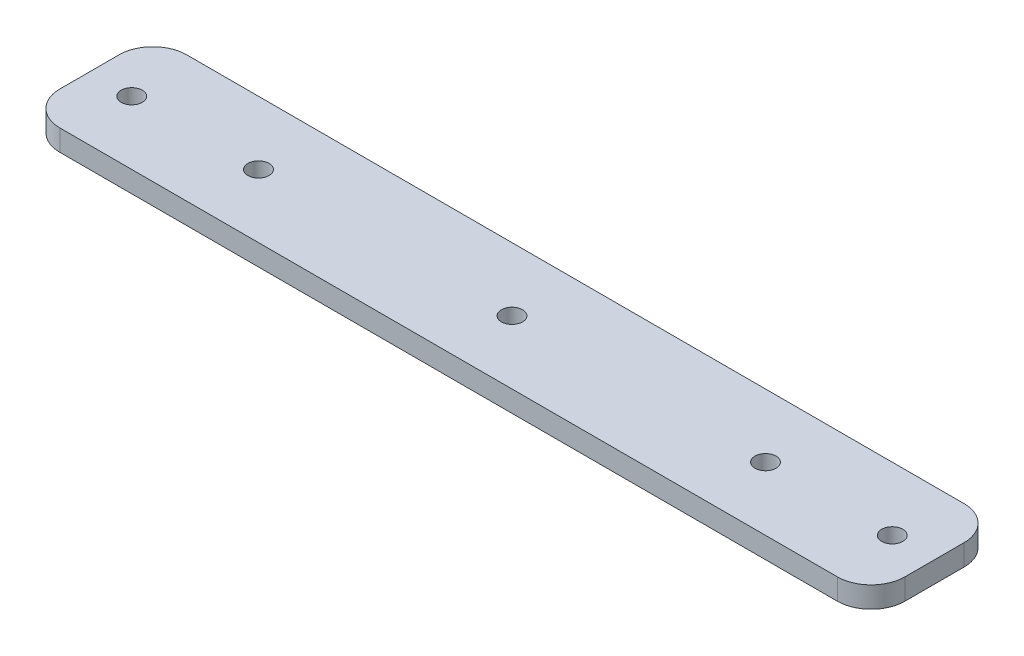
ISO-10303-21;
HEADER;
FILE_DESCRIPTION(('STEP AP214'),'2;1');
FILE_NAME('part.step','',(''),(''),'','','');
FILE_SCHEMA(('AUTOMOTIVE_DESIGN { 1 0 10303 214 1 1 1 1 }'));
ENDSEC;
DATA;
#1=APPLICATION_CONTEXT('core data for automotive mechanical design processes');
#2=APPLICATION_PROTOCOL_DEFINITION('international standard','automotive_design',2000,#1);
#3=PRODUCT_CONTEXT('',#1,'mechanical');
#4=PRODUCT('Part','Part','',(#3));
#5=PRODUCT_RELATED_PRODUCT_CATEGORY('part','',(#4));
#6=PRODUCT_DEFINITION_FORMATION('','',#4);
#7=PRODUCT_DEFINITION_CONTEXT('part definition',#1,'design');
#8=PRODUCT_DEFINITION('design','',#6,#7);
#9=PRODUCT_DEFINITION_SHAPE('','',#8);
#10=(LENGTH_UNIT() NAMED_UNIT(*) SI_UNIT(.MILLI.,.METRE.));
#11=(NAMED_UNIT(*) PLANE_ANGLE_UNIT() SI_UNIT($,.RADIAN.));
#12=(NAMED_UNIT(*) SI_UNIT($,.STERADIAN.) SOLID_ANGLE_UNIT());
#13=UNCERTAINTY_MEASURE_WITH_UNIT(LENGTH_MEASURE(1.E-05),#10,'distance_accuracy_value','');
#14=(GEOMETRIC_REPRESENTATION_CONTEXT(3) GLOBAL_UNCERTAINTY_ASSIGNED_CONTEXT((#13)) GLOBAL_UNIT_ASSIGNED_CONTEXT((#10,
#11,#12)) REPRESENTATION_CONTEXT('',''));
#15=CARTESIAN_POINT('',(0.,0.,0.));
#16=DIRECTION('',(0.,0.,1.));
#17=DIRECTION('',(1.,0.,0.));
#18=AXIS2_PLACEMENT_3D('',#15,#16,#17);
#19=CARTESIAN_POINT('',(243.84,6.35,27.94));
#20=DIRECTION('',(0.,1.,0.));
#21=DIRECTION('',(0.,0.,1.));
#22=AXIS2_PLACEMENT_3D('',#19,#20,#21);
#23=PLANE('',#22);
#24=CARTESIAN_POINT('',(127.,6.35,19.05));
#25=DIRECTION('',(0.,1.,0.));
#26=DIRECTION('',(0.,0.,1.));
#27=AXIS2_PLACEMENT_3D('',#24,#25,#26);
#28=CIRCLE('',#27,3.175);
#29=CARTESIAN_POINT('',(127.,6.35,22.225));
#30=VERTEX_POINT('',#29);
#31=EDGE_CURVE('E198',#30,#30,#28,.T.);
#32=ORIENTED_EDGE('',*,*,#31,.F.);
#33=EDGE_LOOP('',(#32));
#34=FACE_BOUND('',#33,.T.);
#35=CARTESIAN_POINT('',(50.8,6.35,19.05));
#36=DIRECTION('',(0.,1.,0.));
#37=DIRECTION('',(0.,0.,1.));
#38=AXIS2_PLACEMENT_3D('',#35,#36,#37);
#39=CIRCLE('',#38,3.175);
#40=CARTESIAN_POINT('',(50.8,6.35,22.225));
#41=VERTEX_POINT('',#40);
#42=EDGE_CURVE('E186',#41,#41,#39,.T.);
#43=ORIENTED_EDGE('',*,*,#42,.F.);
#44=EDGE_LOOP('',(#43));
#45=FACE_BOUND('',#44,.T.);
#46=CARTESIAN_POINT('',(243.84,6.35,27.94));
#47=DIRECTION('',(0.,1.,0.));
#48=DIRECTION('',(0.,0.,1.));
#49=AXIS2_PLACEMENT_3D('',#46,#47,#48);
#50=CIRCLE('',#49,10.16);
#51=CARTESIAN_POINT('',(243.84,6.35,38.1));
#52=VERTEX_POINT('',#51);
#53=CARTESIAN_POINT('',(254.,6.35,27.9399999999999));
#54=VERTEX_POINT('',#53);
#55=EDGE_CURVE('E149',#52,#54,#50,.T.);
#56=ORIENTED_EDGE('',*,*,#55,.T.);
#57=DIRECTION('',(0.,0.,-1.));
#58=VECTOR('',#57,1.);
#59=CARTESIAN_POINT('',(254.,6.35,10.1600000000001));
#60=LINE('',#59,#58);
#61=CARTESIAN_POINT('',(254.,6.35,10.1600000000001));
#62=VERTEX_POINT('',#61);
#63=EDGE_CURVE('E97',#54,#62,#60,.T.);
#64=ORIENTED_EDGE('',*,*,#63,.T.);
#65=CARTESIAN_POINT('',(243.84,6.35,10.16));
#66=DIRECTION('',(0.,1.,0.));
#67=DIRECTION('',(0.,0.,1.));
#68=AXIS2_PLACEMENT_3D('',#65,#66,#67);
#69=CIRCLE('',#68,10.16);
#70=CARTESIAN_POINT('',(243.84,6.35,0.));
#71=VERTEX_POINT('',#70);
#72=EDGE_CURVE('E164',#62,#71,#69,.T.);
#73=ORIENTED_EDGE('',*,*,#72,.T.);
#74=DIRECTION('',(-1.,0.,0.));
#75=VECTOR('',#74,1.);
#76=CARTESIAN_POINT('',(10.1600000000001,6.35,0.));
#77=LINE('',#76,#75);
#78=CARTESIAN_POINT('',(10.16,6.35,0.));
#79=VERTEX_POINT('',#78);
#80=EDGE_CURVE('E177',#71,#79,#77,.T.);
#81=ORIENTED_EDGE('',*,*,#80,.T.);
#82=CARTESIAN_POINT('',(10.16,6.35,10.16));
#83=DIRECTION('',(0.,1.,0.));
#84=DIRECTION('',(0.,0.,-1.));
#85=AXIS2_PLACEMENT_3D('',#82,#83,#84);
#86=CIRCLE('',#85,10.16);
#87=CARTESIAN_POINT('',(0.,6.35,10.1600000000001));
#88=VERTEX_POINT('',#87);
#89=EDGE_CURVE('E116',#79,#88,#86,.T.);
#90=ORIENTED_EDGE('',*,*,#89,.T.);
#91=DIRECTION('',(0.,0.,1.));
#92=VECTOR('',#91,1.);
#93=CARTESIAN_POINT('',(0.,6.35,10.1600000000001));
#94=LINE('',#93,#92);
#95=CARTESIAN_POINT('',(0.,6.35,27.9399999999999));
#96=VERTEX_POINT('',#95);
#97=EDGE_CURVE('E110',#88,#96,#94,.T.);
#98=ORIENTED_EDGE('',*,*,#97,.T.);
#99=CARTESIAN_POINT('',(10.16,6.35,27.94));
#100=DIRECTION('',(0.,1.,0.));
#101=DIRECTION('',(0.,0.,1.));
#102=AXIS2_PLACEMENT_3D('',#99,#100,#101);
#103=CIRCLE('',#102,10.16);
#104=CARTESIAN_POINT('',(10.1600000000001,6.35,38.1));
#105=VERTEX_POINT('',#104);
#106=EDGE_CURVE('E114',#96,#105,#103,.T.);
#107=ORIENTED_EDGE('',*,*,#106,.T.);
#108=DIRECTION('',(1.,0.,0.));
#109=VECTOR('',#108,1.);
#110=CARTESIAN_POINT('',(10.1600000000001,6.35,38.1));
#111=LINE('',#110,#109);
#112=EDGE_CURVE('E54',#105,#52,#111,.T.);
#113=ORIENTED_EDGE('',*,*,#112,.T.);
#114=EDGE_LOOP('',(#56,#64,#73,#81,#90,#98,#107,#113));
#115=FACE_BOUND('',#114,.T.);
#116=CARTESIAN_POINT('',(12.7,6.35,19.05));
#117=DIRECTION('',(0.,1.,0.));
#118=DIRECTION('',(0.,0.,1.));
#119=AXIS2_PLACEMENT_3D('',#116,#117,#118);
#120=CIRCLE('',#119,3.175);
#121=CARTESIAN_POINT('',(12.7,6.35,22.225));
#122=VERTEX_POINT('',#121);
#123=EDGE_CURVE('E138',#122,#122,#120,.T.);
#124=ORIENTED_EDGE('',*,*,#123,.F.);
#125=EDGE_LOOP('',(#124));
#126=FACE_BOUND('',#125,.T.);
#127=CARTESIAN_POINT('',(241.3,6.35,19.05));
#128=DIRECTION('',(0.,1.,0.));
#129=DIRECTION('',(0.,0.,-1.));
#130=AXIS2_PLACEMENT_3D('',#127,#128,#129);
#131=CIRCLE('',#130,3.175);
#132=CARTESIAN_POINT('',(241.3,6.35,15.875));
#133=VERTEX_POINT('',#132);
#134=EDGE_CURVE('E192',#133,#133,#131,.T.);
#135=ORIENTED_EDGE('',*,*,#134,.F.);
#136=EDGE_LOOP('',(#135));
#137=FACE_BOUND('',#136,.T.);
#138=CARTESIAN_POINT('',(203.2,6.35,19.05));
#139=DIRECTION('',(0.,1.,0.));
#140=DIRECTION('',(0.,0.,1.));
#141=AXIS2_PLACEMENT_3D('',#138,#139,#140);
#142=CIRCLE('',#141,3.175);
#143=CARTESIAN_POINT('',(203.2,6.35,22.225));
#144=VERTEX_POINT('',#143);
#145=EDGE_CURVE('E204',#144,#144,#142,.T.);
#146=ORIENTED_EDGE('',*,*,#145,.F.);
#147=EDGE_LOOP('',(#146));
#148=FACE_BOUND('',#147,.T.);
#149=ADVANCED_FACE('F37',(#34,#45,#115,#126,#137,#148),#23,.T.);
#150=CARTESIAN_POINT('',(243.84,0.,27.94));
#151=DIRECTION('',(0.,1.,0.));
#152=DIRECTION('',(0.,0.,1.));
#153=AXIS2_PLACEMENT_3D('',#150,#151,#152);
#154=PLANE('',#153);
#155=CARTESIAN_POINT('',(243.84,0.,27.94));
#156=DIRECTION('',(0.,1.,0.));
#157=DIRECTION('',(0.,0.,1.));
#158=AXIS2_PLACEMENT_3D('',#155,#156,#157);
#159=CIRCLE('',#158,10.16);
#160=CARTESIAN_POINT('',(243.84,0.,38.1));
#161=VERTEX_POINT('',#160);
#162=CARTESIAN_POINT('',(254.,0.,27.9399999999999));
#163=VERTEX_POINT('',#162);
#164=EDGE_CURVE('E134',#161,#163,#159,.T.);
#165=ORIENTED_EDGE('',*,*,#164,.F.);
#166=DIRECTION('',(1.,0.,0.));
#167=VECTOR('',#166,1.);
#168=CARTESIAN_POINT('',(10.1600000000001,0.,38.1));
#169=LINE('',#168,#167);
#170=CARTESIAN_POINT('',(10.1600000000001,0.,38.1));
#171=VERTEX_POINT('',#170);
#172=EDGE_CURVE('E89',#171,#161,#169,.T.);
#173=ORIENTED_EDGE('',*,*,#172,.F.);
#174=CARTESIAN_POINT('',(10.16,0.,27.94));
#175=DIRECTION('',(0.,1.,0.));
#176=DIRECTION('',(0.,0.,1.));
#177=AXIS2_PLACEMENT_3D('',#174,#175,#176);
#178=CIRCLE('',#177,10.16);
#179=CARTESIAN_POINT('',(0.,0.,27.9399999999999));
#180=VERTEX_POINT('',#179);
#181=EDGE_CURVE('E83',#180,#171,#178,.T.);
#182=ORIENTED_EDGE('',*,*,#181,.F.);
#183=DIRECTION('',(0.,0.,1.));
#184=VECTOR('',#183,1.);
#185=CARTESIAN_POINT('',(0.,0.,10.1600000000001));
#186=LINE('',#185,#184);
#187=CARTESIAN_POINT('',(0.,0.,10.1600000000001));
#188=VERTEX_POINT('',#187);
#189=EDGE_CURVE('E124',#188,#180,#186,.T.);
#190=ORIENTED_EDGE('',*,*,#189,.F.);
#191=CARTESIAN_POINT('',(10.16,0.,10.16));
#192=DIRECTION('',(0.,1.,0.));
#193=DIRECTION('',(0.,0.,-1.));
#194=AXIS2_PLACEMENT_3D('',#191,#192,#193);
#195=CIRCLE('',#194,10.16);
#196=CARTESIAN_POINT('',(10.16,0.,0.));
#197=VERTEX_POINT('',#196);
#198=EDGE_CURVE('E144',#197,#188,#195,.T.);
#199=ORIENTED_EDGE('',*,*,#198,.F.);
#200=DIRECTION('',(-1.,0.,0.));
#201=VECTOR('',#200,1.);
#202=CARTESIAN_POINT('',(10.1600000000001,0.,0.));
#203=LINE('',#202,#201);
#204=CARTESIAN_POINT('',(243.84,0.,0.));
#205=VERTEX_POINT('',#204);
#206=EDGE_CURVE('E142',#205,#197,#203,.T.);
#207=ORIENTED_EDGE('',*,*,#206,.F.);
#208=CARTESIAN_POINT('',(243.84,0.,10.16));
#209=DIRECTION('',(0.,1.,0.));
#210=DIRECTION('',(0.,0.,1.));
#211=AXIS2_PLACEMENT_3D('',#208,#209,#210);
#212=CIRCLE('',#211,10.16);
#213=CARTESIAN_POINT('',(254.,0.,10.1600000000001));
#214=VERTEX_POINT('',#213);
#215=EDGE_CURVE('E140',#214,#205,#212,.T.);
#216=ORIENTED_EDGE('',*,*,#215,.F.);
#217=DIRECTION('',(0.,0.,-1.));
#218=VECTOR('',#217,1.);
#219=CARTESIAN_POINT('',(254.,0.,10.1600000000001));
#220=LINE('',#219,#218);
#221=EDGE_CURVE('E137',#163,#214,#220,.T.);
#222=ORIENTED_EDGE('',*,*,#221,.F.);
#223=EDGE_LOOP('',(#165,#173,#182,#190,#199,#207,#216,#222));
#224=FACE_BOUND('',#223,.T.);
#225=CARTESIAN_POINT('',(12.7,0.,19.05));
#226=DIRECTION('',(0.,1.,0.));
#227=DIRECTION('',(0.,0.,1.));
#228=AXIS2_PLACEMENT_3D('',#225,#226,#227);
#229=CIRCLE('',#228,3.175);
#230=CARTESIAN_POINT('',(12.7,0.,22.225));
#231=VERTEX_POINT('',#230);
#232=EDGE_CURVE('E183',#231,#231,#229,.T.);
#233=ORIENTED_EDGE('',*,*,#232,.T.);
#234=EDGE_LOOP('',(#233));
#235=FACE_BOUND('',#234,.T.);
#236=CARTESIAN_POINT('',(50.8,0.,19.05));
#237=DIRECTION('',(0.,1.,0.));
#238=DIRECTION('',(0.,0.,1.));
#239=AXIS2_PLACEMENT_3D('',#236,#237,#238);
#240=CIRCLE('',#239,3.175);
#241=CARTESIAN_POINT('',(50.8,0.,22.225));
#242=VERTEX_POINT('',#241);
#243=EDGE_CURVE('E189',#242,#242,#240,.T.);
#244=ORIENTED_EDGE('',*,*,#243,.T.);
#245=EDGE_LOOP('',(#244));
#246=FACE_BOUND('',#245,.T.);
#247=CARTESIAN_POINT('',(241.3,0.,19.05));
#248=DIRECTION('',(0.,1.,0.));
#249=DIRECTION('',(0.,0.,-1.));
#250=AXIS2_PLACEMENT_3D('',#247,#248,#249);
#251=CIRCLE('',#250,3.175);
#252=CARTESIAN_POINT('',(241.3,0.,15.875));
#253=VERTEX_POINT('',#252);
#254=EDGE_CURVE('E195',#253,#253,#251,.T.);
#255=ORIENTED_EDGE('',*,*,#254,.T.);
#256=EDGE_LOOP('',(#255));
#257=FACE_BOUND('',#256,.T.);
#258=CARTESIAN_POINT('',(127.,0.,19.05));
#259=DIRECTION('',(0.,1.,0.));
#260=DIRECTION('',(0.,0.,1.));
#261=AXIS2_PLACEMENT_3D('',#258,#259,#260);
#262=CIRCLE('',#261,3.175);
#263=CARTESIAN_POINT('',(127.,0.,22.225));
#264=VERTEX_POINT('',#263);
#265=EDGE_CURVE('E201',#264,#264,#262,.T.);
#266=ORIENTED_EDGE('',*,*,#265,.T.);
#267=EDGE_LOOP('',(#266));
#268=FACE_BOUND('',#267,.T.);
#269=CARTESIAN_POINT('',(203.2,0.,19.05));
#270=DIRECTION('',(0.,1.,0.));
#271=DIRECTION('',(0.,0.,1.));
#272=AXIS2_PLACEMENT_3D('',#269,#270,#271);
#273=CIRCLE('',#272,3.175);
#274=CARTESIAN_POINT('',(203.2,0.,22.225));
#275=VERTEX_POINT('',#274);
#276=EDGE_CURVE('E207',#275,#275,#273,.T.);
#277=ORIENTED_EDGE('',*,*,#276,.T.);
#278=EDGE_LOOP('',(#277));
#279=FACE_BOUND('',#278,.T.);
#280=ADVANCED_FACE('F168',(#224,#235,#246,#257,#268,#279),#154,.F.);
#281=CARTESIAN_POINT('',(243.84,6.35,27.94));
#282=DIRECTION('',(0.,-1.,0.));
#283=DIRECTION('',(0.,0.,-1.));
#284=AXIS2_PLACEMENT_3D('',#281,#282,#283);
#285=CYLINDRICAL_SURFACE('',#284,10.16);
#286=ORIENTED_EDGE('',*,*,#164,.T.);
#287=DIRECTION('',(0.,-1.,0.));
#288=VECTOR('',#287,1.);
#289=CARTESIAN_POINT('',(254.,6.35,27.9399999999999));
#290=LINE('',#289,#288);
#291=EDGE_CURVE('E11',#54,#163,#290,.T.);
#292=ORIENTED_EDGE('',*,*,#291,.F.);
#293=ORIENTED_EDGE('',*,*,#55,.F.);
#294=DIRECTION('',(0.,-1.,0.));
#295=VECTOR('',#294,1.);
#296=CARTESIAN_POINT('',(243.84,6.35,38.1));
#297=LINE('',#296,#295);
#298=EDGE_CURVE('E130',#52,#161,#297,.T.);
#299=ORIENTED_EDGE('',*,*,#298,.T.);
#300=EDGE_LOOP('',(#286,#292,#293,#299));
#301=FACE_BOUND('',#300,.T.);
#302=ADVANCED_FACE('F39',(#301),#285,.T.);
#303=CARTESIAN_POINT('',(254.,6.35,10.1600000000001));
#304=DIRECTION('',(-1.,0.,0.));
#305=DIRECTION('',(0.,0.,1.));
#306=AXIS2_PLACEMENT_3D('',#303,#304,#305);
#307=PLANE('',#306);
#308=ORIENTED_EDGE('',*,*,#221,.T.);
#309=DIRECTION('',(0.,-1.,0.));
#310=VECTOR('',#309,1.);
#311=CARTESIAN_POINT('',(254.,6.35,10.1600000000001));
#312=LINE('',#311,#310);
#313=EDGE_CURVE('E46',#62,#214,#312,.T.);
#314=ORIENTED_EDGE('',*,*,#313,.F.);
#315=ORIENTED_EDGE('',*,*,#63,.F.);
#316=ORIENTED_EDGE('',*,*,#291,.T.);
#317=EDGE_LOOP('',(#308,#314,#315,#316));
#318=FACE_BOUND('',#317,.T.);
#319=ADVANCED_FACE('F241',(#318),#307,.F.);
#320=CARTESIAN_POINT('',(243.84,6.35,10.16));
#321=DIRECTION('',(0.,-1.,0.));
#322=DIRECTION('',(0.,0.,-1.));
#323=AXIS2_PLACEMENT_3D('',#320,#321,#322);
#324=CYLINDRICAL_SURFACE('',#323,10.16);
#325=ORIENTED_EDGE('',*,*,#215,.T.);
#326=DIRECTION('',(0.,-1.,0.));
#327=VECTOR('',#326,1.);
#328=CARTESIAN_POINT('',(243.84,6.35,0.));
#329=LINE('',#328,#327);
#330=EDGE_CURVE('E156',#71,#205,#329,.T.);
#331=ORIENTED_EDGE('',*,*,#330,.F.);
#332=ORIENTED_EDGE('',*,*,#72,.F.);
#333=ORIENTED_EDGE('',*,*,#313,.T.);
#334=EDGE_LOOP('',(#325,#331,#332,#333));
#335=FACE_BOUND('',#334,.T.);
#336=ADVANCED_FACE('F162',(#335),#324,.T.);
#337=CARTESIAN_POINT('',(10.1600000000001,6.35,0.));
#338=DIRECTION('',(0.,0.,1.));
#339=DIRECTION('',(1.,0.,0.));
#340=AXIS2_PLACEMENT_3D('',#337,#338,#339);
#341=PLANE('',#340);
#342=ORIENTED_EDGE('',*,*,#206,.T.);
#343=DIRECTION('',(0.,-1.,0.));
#344=VECTOR('',#343,1.);
#345=CARTESIAN_POINT('',(10.16,6.35,0.));
#346=LINE('',#345,#344);
#347=EDGE_CURVE('E153',#79,#197,#346,.T.);
#348=ORIENTED_EDGE('',*,*,#347,.F.);
#349=ORIENTED_EDGE('',*,*,#80,.F.);
#350=ORIENTED_EDGE('',*,*,#330,.T.);
#351=EDGE_LOOP('',(#342,#348,#349,#350));
#352=FACE_BOUND('',#351,.T.);
#353=ADVANCED_FACE('F173',(#352),#341,.F.);
#354=CARTESIAN_POINT('',(10.16,6.35,10.16));
#355=DIRECTION('',(0.,-1.,0.));
#356=DIRECTION('',(0.,0.,-1.));
#357=AXIS2_PLACEMENT_3D('',#354,#355,#356);
#358=CYLINDRICAL_SURFACE('',#357,10.16);
#359=ORIENTED_EDGE('',*,*,#198,.T.);
#360=DIRECTION('',(0.,-1.,0.));
#361=VECTOR('',#360,1.);
#362=CARTESIAN_POINT('',(0.,6.35,10.1600000000001));
#363=LINE('',#362,#361);
#364=EDGE_CURVE('E125',#88,#188,#363,.T.);
#365=ORIENTED_EDGE('',*,*,#364,.F.);
#366=ORIENTED_EDGE('',*,*,#89,.F.);
#367=ORIENTED_EDGE('',*,*,#347,.T.);
#368=EDGE_LOOP('',(#359,#365,#366,#367));
#369=FACE_BOUND('',#368,.T.);
#370=ADVANCED_FACE('F176',(#369),#358,.T.);
#371=CARTESIAN_POINT('',(0.,6.35,10.1600000000001));
#372=DIRECTION('',(1.,0.,0.));
#373=DIRECTION('',(0.,0.,-1.));
#374=AXIS2_PLACEMENT_3D('',#371,#372,#373);
#375=PLANE('',#374);
#376=ORIENTED_EDGE('',*,*,#189,.T.);
#377=DIRECTION('',(0.,-1.,0.));
#378=VECTOR('',#377,1.);
#379=CARTESIAN_POINT('',(0.,6.35,27.9399999999999));
#380=LINE('',#379,#378);
#381=EDGE_CURVE('E121',#96,#180,#380,.T.);
#382=ORIENTED_EDGE('',*,*,#381,.F.);
#383=ORIENTED_EDGE('',*,*,#97,.F.);
#384=ORIENTED_EDGE('',*,*,#364,.T.);
#385=EDGE_LOOP('',(#376,#382,#383,#384));
#386=FACE_BOUND('',#385,.T.);
#387=ADVANCED_FACE('F122',(#386),#375,.F.);
#388=CARTESIAN_POINT('',(10.16,6.35,27.94));
#389=DIRECTION('',(0.,-1.,0.));
#390=DIRECTION('',(0.,0.,-1.));
#391=AXIS2_PLACEMENT_3D('',#388,#389,#390);
#392=CYLINDRICAL_SURFACE('',#391,10.16);
#393=ORIENTED_EDGE('',*,*,#181,.T.);
#394=DIRECTION('',(0.,-1.,0.));
#395=VECTOR('',#394,1.);
#396=CARTESIAN_POINT('',(10.1600000000001,6.35,38.1));
#397=LINE('',#396,#395);
#398=EDGE_CURVE('E126',#105,#171,#397,.T.);
#399=ORIENTED_EDGE('',*,*,#398,.F.);
#400=ORIENTED_EDGE('',*,*,#106,.F.);
#401=ORIENTED_EDGE('',*,*,#381,.T.);
#402=EDGE_LOOP('',(#393,#399,#400,#401));
#403=FACE_BOUND('',#402,.T.);
#404=ADVANCED_FACE('F128',(#403),#392,.T.);
#405=CARTESIAN_POINT('',(10.1600000000001,6.35,38.1));
#406=DIRECTION('',(0.,0.,-1.));
#407=DIRECTION('',(-1.,0.,0.));
#408=AXIS2_PLACEMENT_3D('',#405,#406,#407);
#409=PLANE('',#408);
#410=ORIENTED_EDGE('',*,*,#172,.T.);
#411=ORIENTED_EDGE('',*,*,#298,.F.);
#412=ORIENTED_EDGE('',*,*,#112,.F.);
#413=ORIENTED_EDGE('',*,*,#398,.T.);
#414=EDGE_LOOP('',(#410,#411,#412,#413));
#415=FACE_BOUND('',#414,.T.);
#416=ADVANCED_FACE('F229',(#415),#409,.F.);
#417=CARTESIAN_POINT('',(12.7,6.35,19.05));
#418=DIRECTION('',(0.,-1.,0.));
#419=DIRECTION('',(0.,0.,-1.));
#420=AXIS2_PLACEMENT_3D('',#417,#418,#419);
#421=CYLINDRICAL_SURFACE('',#420,3.175);
#422=ORIENTED_EDGE('',*,*,#123,.T.);
#423=EDGE_LOOP('',(#422));
#424=FACE_BOUND('',#423,.T.);
#425=ORIENTED_EDGE('',*,*,#232,.F.);
#426=EDGE_LOOP('',(#425));
#427=FACE_BOUND('',#426,.T.);
#428=ADVANCED_FACE('F226',(#424,#427),#421,.F.);
#429=CARTESIAN_POINT('',(50.8,6.35,19.05));
#430=DIRECTION('',(0.,-1.,0.));
#431=DIRECTION('',(0.,0.,-1.));
#432=AXIS2_PLACEMENT_3D('',#429,#430,#431);
#433=CYLINDRICAL_SURFACE('',#432,3.175);
#434=ORIENTED_EDGE('',*,*,#42,.T.);
#435=EDGE_LOOP('',(#434));
#436=FACE_BOUND('',#435,.T.);
#437=ORIENTED_EDGE('',*,*,#243,.F.);
#438=EDGE_LOOP('',(#437));
#439=FACE_BOUND('',#438,.T.);
#440=ADVANCED_FACE('F305',(#436,#439),#433,.F.);
#441=CARTESIAN_POINT('',(241.3,6.35,19.05));
#442=DIRECTION('',(0.,-1.,0.));
#443=DIRECTION('',(0.,0.,-1.));
#444=AXIS2_PLACEMENT_3D('',#441,#442,#443);
#445=CYLINDRICAL_SURFACE('',#444,3.175);
#446=ORIENTED_EDGE('',*,*,#134,.T.);
#447=EDGE_LOOP('',(#446));
#448=FACE_BOUND('',#447,.T.);
#449=ORIENTED_EDGE('',*,*,#254,.F.);
#450=EDGE_LOOP('',(#449));
#451=FACE_BOUND('',#450,.T.);
#452=ADVANCED_FACE('F313',(#448,#451),#445,.F.);
#453=CARTESIAN_POINT('',(127.,6.35,19.05));
#454=DIRECTION('',(0.,-1.,0.));
#455=DIRECTION('',(0.,0.,-1.));
#456=AXIS2_PLACEMENT_3D('',#453,#454,#455);
#457=CYLINDRICAL_SURFACE('',#456,3.175);
#458=ORIENTED_EDGE('',*,*,#31,.T.);
#459=EDGE_LOOP('',(#458));
#460=FACE_BOUND('',#459,.T.);
#461=ORIENTED_EDGE('',*,*,#265,.F.);
#462=EDGE_LOOP('',(#461));
#463=FACE_BOUND('',#462,.T.);
#464=ADVANCED_FACE('F321',(#460,#463),#457,.F.);
#465=CARTESIAN_POINT('',(203.2,6.35,19.05));
#466=DIRECTION('',(0.,-1.,0.));
#467=DIRECTION('',(0.,0.,-1.));
#468=AXIS2_PLACEMENT_3D('',#465,#466,#467);
#469=CYLINDRICAL_SURFACE('',#468,3.175);
#470=ORIENTED_EDGE('',*,*,#145,.T.);
#471=EDGE_LOOP('',(#470));
#472=FACE_BOUND('',#471,.T.);
#473=ORIENTED_EDGE('',*,*,#276,.F.);
#474=EDGE_LOOP('',(#473));
#475=FACE_BOUND('',#474,.T.);
#476=ADVANCED_FACE('F213',(#472,#475),#469,.F.);
#477=CLOSED_SHELL('',(#149,#280,#302,#319,#336,#353,#370,#387,#404,#416,#428,#440,#452,#464,#476));
#478=MANIFOLD_SOLID_BREP('B2',#477);
#479=ADVANCED_BREP_SHAPE_REPRESENTATION('',(#18,#478),#14);
#480=SHAPE_DEFINITION_REPRESENTATION(#9,#479);
ENDSEC;
END-ISO-10303-21;
